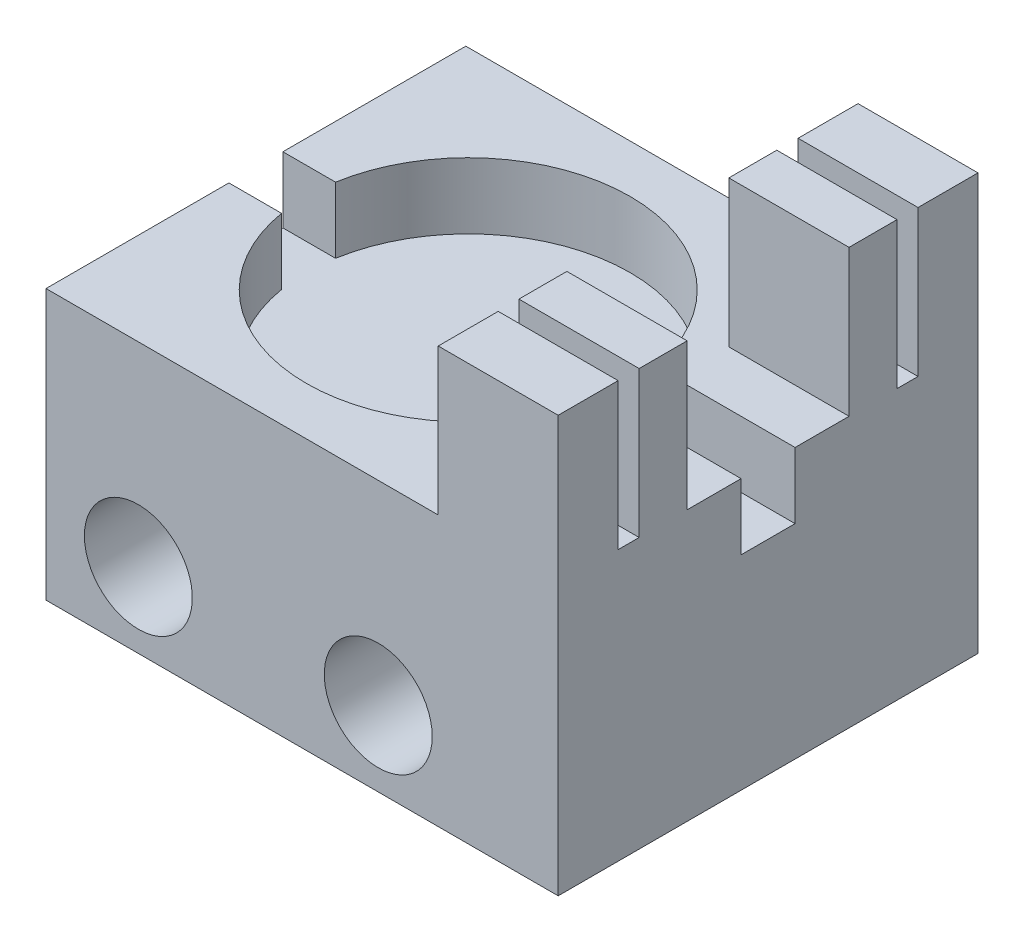
ISO-10303-21;
HEADER;
FILE_DESCRIPTION(('STEP AP214'),'2;1');
FILE_NAME('part.step','',(''),(''),'','','');
FILE_SCHEMA(('AUTOMOTIVE_DESIGN { 1 0 10303 214 1 1 1 1 }'));
ENDSEC;
DATA;
#1=APPLICATION_CONTEXT('core data for automotive mechanical design processes');
#2=APPLICATION_PROTOCOL_DEFINITION('international standard','automotive_design',2000,#1);
#3=PRODUCT_CONTEXT('',#1,'mechanical');
#4=PRODUCT('Part','Part','',(#3));
#5=PRODUCT_RELATED_PRODUCT_CATEGORY('part','',(#4));
#6=PRODUCT_DEFINITION_FORMATION('','',#4);
#7=PRODUCT_DEFINITION_CONTEXT('part definition',#1,'design');
#8=PRODUCT_DEFINITION('design','',#6,#7);
#9=PRODUCT_DEFINITION_SHAPE('','',#8);
#10=(LENGTH_UNIT() NAMED_UNIT(*) SI_UNIT(.MILLI.,.METRE.));
#11=(NAMED_UNIT(*) PLANE_ANGLE_UNIT() SI_UNIT($,.RADIAN.));
#12=(NAMED_UNIT(*) SI_UNIT($,.STERADIAN.) SOLID_ANGLE_UNIT());
#13=UNCERTAINTY_MEASURE_WITH_UNIT(LENGTH_MEASURE(1.E-05),#10,'distance_accuracy_value','');
#14=(GEOMETRIC_REPRESENTATION_CONTEXT(3) GLOBAL_UNCERTAINTY_ASSIGNED_CONTEXT((#13)) GLOBAL_UNIT_ASSIGNED_CONTEXT((#10,
#11,#12)) REPRESENTATION_CONTEXT('',''));
#15=CARTESIAN_POINT('',(0.,0.,0.));
#16=DIRECTION('',(0.,0.,1.));
#17=DIRECTION('',(1.,0.,0.));
#18=AXIS2_PLACEMENT_3D('',#15,#16,#17);
#19=CARTESIAN_POINT('',(-25.,11.25,35.));
#20=DIRECTION('',(0.,-1.,0.));
#21=DIRECTION('',(0.,0.,-1.));
#22=AXIS2_PLACEMENT_3D('',#19,#20,#21);
#23=PLANE('',#22);
#24=DIRECTION('',(1.,0.,0.));
#25=VECTOR('',#24,1.);
#26=CARTESIAN_POINT('',(-13.3111795119741,11.25,19.75));
#27=LINE('',#26,#25);
#28=CARTESIAN_POINT('',(-17.7,11.25,19.75));
#29=VERTEX_POINT('',#28);
#30=CARTESIAN_POINT('',(-13.3111795119741,11.25,19.75));
#31=VERTEX_POINT('',#30);
#32=EDGE_CURVE('E229',#29,#31,#27,.T.);
#33=ORIENTED_EDGE('',*,*,#32,.F.);
#34=DIRECTION('',(0.,0.,-1.));
#35=VECTOR('',#34,1.);
#36=CARTESIAN_POINT('',(-17.7,11.25,35.));
#37=LINE('',#36,#35);
#38=CARTESIAN_POINT('',(-17.7,11.25,35.));
#39=VERTEX_POINT('',#38);
#40=EDGE_CURVE('E215',#39,#29,#37,.T.);
#41=ORIENTED_EDGE('',*,*,#40,.F.);
#42=DIRECTION('',(-1.,0.,0.));
#43=VECTOR('',#42,1.);
#44=CARTESIAN_POINT('',(-25.,11.25,35.));
#45=LINE('',#44,#43);
#46=CARTESIAN_POINT('',(15.,11.25,35.));
#47=VERTEX_POINT('',#46);
#48=EDGE_CURVE('E227',#47,#39,#45,.T.);
#49=ORIENTED_EDGE('',*,*,#48,.F.);
#50=DIRECTION('',(0.,0.,1.));
#51=VECTOR('',#50,1.);
#52=CARTESIAN_POINT('',(15.,11.25,35.));
#53=LINE('',#52,#51);
#54=CARTESIAN_POINT('',(15.,11.25,30.));
#55=VERTEX_POINT('',#54);
#56=EDGE_CURVE('E713',#55,#47,#53,.T.);
#57=ORIENTED_EDGE('',*,*,#56,.F.);
#58=DIRECTION('',(-1.,0.,0.));
#59=VECTOR('',#58,1.);
#60=CARTESIAN_POINT('',(25.,11.25,30.));
#61=LINE('',#60,#59);
#62=CARTESIAN_POINT('',(25.,11.25,30.));
#63=VERTEX_POINT('',#62);
#64=EDGE_CURVE('E704',#63,#55,#61,.T.);
#65=ORIENTED_EDGE('',*,*,#64,.F.);
#66=DIRECTION('',(0.,0.,-1.));
#67=VECTOR('',#66,1.);
#68=CARTESIAN_POINT('',(25.,11.25,35.));
#69=LINE('',#68,#67);
#70=CARTESIAN_POINT('',(25.,11.25,28.25));
#71=VERTEX_POINT('',#70);
#72=EDGE_CURVE('E48',#63,#71,#69,.T.);
#73=ORIENTED_EDGE('',*,*,#72,.T.);
#74=DIRECTION('',(1.,0.,0.));
#75=VECTOR('',#74,1.);
#76=CARTESIAN_POINT('',(25.,11.25,28.25));
#77=LINE('',#76,#75);
#78=CARTESIAN_POINT('',(14.975994484749,11.25,28.25));
#79=VERTEX_POINT('',#78);
#80=EDGE_CURVE('E742',#79,#71,#77,.T.);
#81=ORIENTED_EDGE('',*,*,#80,.F.);
#82=DIRECTION('',(0.,0.,1.));
#83=VECTOR('',#82,1.);
#84=CARTESIAN_POINT('',(14.975994484749,11.25,28.25));
#85=LINE('',#84,#83);
#86=CARTESIAN_POINT('',(14.975994484749,11.25,24.25));
#87=VERTEX_POINT('',#86);
#88=EDGE_CURVE('E755',#87,#79,#85,.T.);
#89=ORIENTED_EDGE('',*,*,#88,.F.);
#90=DIRECTION('',(-1.,0.,0.));
#91=VECTOR('',#90,1.);
#92=CARTESIAN_POINT('',(25.,11.25,24.25));
#93=LINE('',#92,#91);
#94=CARTESIAN_POINT('',(25.,11.25,24.25));
#95=VERTEX_POINT('',#94);
#96=EDGE_CURVE('E736',#95,#87,#93,.T.);
#97=ORIENTED_EDGE('',*,*,#96,.F.);
#98=CARTESIAN_POINT('',(25.,11.25,19.75));
#99=VERTEX_POINT('',#98);
#100=EDGE_CURVE('E259',#95,#99,#69,.T.);
#101=ORIENTED_EDGE('',*,*,#100,.T.);
#102=DIRECTION('',(1.,0.,0.));
#103=VECTOR('',#102,1.);
#104=CARTESIAN_POINT('',(25.,11.25,19.75));
#105=LINE('',#104,#103);
#106=CARTESIAN_POINT('',(13.3111795119741,11.25,19.75));
#107=VERTEX_POINT('',#106);
#108=EDGE_CURVE('E350',#107,#99,#105,.T.);
#109=ORIENTED_EDGE('',*,*,#108,.F.);
#110=CARTESIAN_POINT('',(0.,11.25,17.5));
#111=DIRECTION('',(0.,1.,0.));
#112=DIRECTION('',(0.,0.,1.));
#113=AXIS2_PLACEMENT_3D('',#110,#111,#112);
#114=CIRCLE('',#113,13.5);
#115=EDGE_CURVE('E346',#31,#107,#114,.T.);
#116=ORIENTED_EDGE('',*,*,#115,.F.);
#117=EDGE_LOOP('',(#33,#41,#49,#57,#65,#73,#81,#89,#97,#101,#109,#116));
#118=FACE_BOUND('',#117,.T.);
#119=ADVANCED_FACE('F39',(#118),#23,.F.);
#120=DIRECTION('',(-1.,0.,0.));
#121=VECTOR('',#120,1.);
#122=CARTESIAN_POINT('',(-25.,11.25,0.));
#123=LINE('',#122,#121);
#124=CARTESIAN_POINT('',(15.,11.25,0.));
#125=VERTEX_POINT('',#124);
#126=CARTESIAN_POINT('',(-17.7,11.25,0.));
#127=VERTEX_POINT('',#126);
#128=EDGE_CURVE('E248',#125,#127,#123,.T.);
#129=ORIENTED_EDGE('',*,*,#128,.T.);
#130=CARTESIAN_POINT('',(-17.7,11.25,15.25));
#131=VERTEX_POINT('',#130);
#132=EDGE_CURVE('E220',#131,#127,#37,.T.);
#133=ORIENTED_EDGE('',*,*,#132,.F.);
#134=DIRECTION('',(-1.,0.,0.));
#135=VECTOR('',#134,1.);
#136=CARTESIAN_POINT('',(-13.3111795119741,11.25,15.25));
#137=LINE('',#136,#135);
#138=CARTESIAN_POINT('',(-13.3111795119741,11.25,15.25));
#139=VERTEX_POINT('',#138);
#140=EDGE_CURVE('E311',#139,#131,#137,.T.);
#141=ORIENTED_EDGE('',*,*,#140,.F.);
#142=CARTESIAN_POINT('',(0.,11.25,17.5));
#143=DIRECTION('',(0.,1.,0.));
#144=DIRECTION('',(0.,0.,1.));
#145=AXIS2_PLACEMENT_3D('',#142,#143,#144);
#146=CIRCLE('',#145,13.5);
#147=CARTESIAN_POINT('',(13.3111795119741,11.25,15.25));
#148=VERTEX_POINT('',#147);
#149=EDGE_CURVE('E317',#148,#139,#146,.T.);
#150=ORIENTED_EDGE('',*,*,#149,.F.);
#151=DIRECTION('',(-1.,0.,0.));
#152=VECTOR('',#151,1.);
#153=CARTESIAN_POINT('',(25.,11.25,15.25));
#154=LINE('',#153,#152);
#155=CARTESIAN_POINT('',(25.,11.25,15.25));
#156=VERTEX_POINT('',#155);
#157=EDGE_CURVE('E354',#156,#148,#154,.T.);
#158=ORIENTED_EDGE('',*,*,#157,.F.);
#159=CARTESIAN_POINT('',(25.,11.25,10.75));
#160=VERTEX_POINT('',#159);
#161=EDGE_CURVE('E260',#156,#160,#69,.T.);
#162=ORIENTED_EDGE('',*,*,#161,.T.);
#163=DIRECTION('',(1.,0.,0.));
#164=VECTOR('',#163,1.);
#165=CARTESIAN_POINT('',(25.,11.25,10.75));
#166=LINE('',#165,#164);
#167=CARTESIAN_POINT('',(14.975994484749,11.25,10.75));
#168=VERTEX_POINT('',#167);
#169=EDGE_CURVE('E780',#168,#160,#166,.T.);
#170=ORIENTED_EDGE('',*,*,#169,.F.);
#171=DIRECTION('',(0.,0.,1.));
#172=VECTOR('',#171,1.);
#173=CARTESIAN_POINT('',(14.975994484749,11.25,6.75));
#174=LINE('',#173,#172);
#175=CARTESIAN_POINT('',(14.975994484749,11.25,6.75));
#176=VERTEX_POINT('',#175);
#177=EDGE_CURVE('E792',#176,#168,#174,.T.);
#178=ORIENTED_EDGE('',*,*,#177,.F.);
#179=DIRECTION('',(-1.,0.,0.));
#180=VECTOR('',#179,1.);
#181=CARTESIAN_POINT('',(25.,11.25,6.75));
#182=LINE('',#181,#180);
#183=CARTESIAN_POINT('',(25.,11.25,6.75));
#184=VERTEX_POINT('',#183);
#185=EDGE_CURVE('E278',#184,#176,#182,.T.);
#186=ORIENTED_EDGE('',*,*,#185,.F.);
#187=CARTESIAN_POINT('',(25.,11.25,5.));
#188=VERTEX_POINT('',#187);
#189=EDGE_CURVE('E257',#184,#188,#69,.T.);
#190=ORIENTED_EDGE('',*,*,#189,.T.);
#191=DIRECTION('',(1.,0.,0.));
#192=VECTOR('',#191,1.);
#193=CARTESIAN_POINT('',(25.,11.25,5.));
#194=LINE('',#193,#192);
#195=CARTESIAN_POINT('',(15.,11.25,5.));
#196=VERTEX_POINT('',#195);
#197=EDGE_CURVE('E275',#196,#188,#194,.T.);
#198=ORIENTED_EDGE('',*,*,#197,.F.);
#199=DIRECTION('',(0.,0.,1.));
#200=VECTOR('',#199,1.);
#201=CARTESIAN_POINT('',(15.,11.25,0.));
#202=LINE('',#201,#200);
#203=EDGE_CURVE('E294',#125,#196,#202,.T.);
#204=ORIENTED_EDGE('',*,*,#203,.F.);
#205=EDGE_LOOP('',(#129,#133,#141,#150,#158,#162,#170,#178,#186,#190,#198,#204));
#206=FACE_BOUND('',#205,.T.);
#207=ADVANCED_FACE('F273',(#206),#23,.F.);
#208=CARTESIAN_POINT('',(25.,-11.25,35.));
#209=DIRECTION('',(-1.,0.,0.));
#210=DIRECTION('',(0.,0.,1.));
#211=AXIS2_PLACEMENT_3D('',#208,#209,#210);
#212=PLANE('',#211);
#213=ORIENTED_EDGE('',*,*,#161,.F.);
#214=DIRECTION('',(0.,1.,0.));
#215=VECTOR('',#214,1.);
#216=CARTESIAN_POINT('',(25.,5.75,15.25));
#217=LINE('',#216,#215);
#218=CARTESIAN_POINT('',(25.,5.75,15.25));
#219=VERTEX_POINT('',#218);
#220=EDGE_CURVE('E368',#219,#156,#217,.T.);
#221=ORIENTED_EDGE('',*,*,#220,.F.);
#222=DIRECTION('',(0.,0.,-1.));
#223=VECTOR('',#222,1.);
#224=CARTESIAN_POINT('',(25.,5.75,19.75));
#225=LINE('',#224,#223);
#226=CARTESIAN_POINT('',(25.,5.75,19.75));
#227=VERTEX_POINT('',#226);
#228=EDGE_CURVE('E328',#227,#219,#225,.T.);
#229=ORIENTED_EDGE('',*,*,#228,.F.);
#230=DIRECTION('',(0.,1.,0.));
#231=VECTOR('',#230,1.);
#232=CARTESIAN_POINT('',(25.,5.75,19.75));
#233=LINE('',#232,#231);
#234=EDGE_CURVE('E371',#227,#99,#233,.T.);
#235=ORIENTED_EDGE('',*,*,#234,.T.);
#236=ORIENTED_EDGE('',*,*,#100,.F.);
#237=DIRECTION('',(0.,-1.,0.));
#238=VECTOR('',#237,1.);
#239=CARTESIAN_POINT('',(25.,23.45,24.25));
#240=LINE('',#239,#238);
#241=CARTESIAN_POINT('',(25.,23.45,24.25));
#242=VERTEX_POINT('',#241);
#243=EDGE_CURVE('E772',#242,#95,#240,.T.);
#244=ORIENTED_EDGE('',*,*,#243,.F.);
#245=DIRECTION('',(0.,0.,-1.));
#246=VECTOR('',#245,1.);
#247=CARTESIAN_POINT('',(25.,23.45,28.25));
#248=LINE('',#247,#246);
#249=CARTESIAN_POINT('',(25.,23.45,28.25));
#250=VERTEX_POINT('',#249);
#251=EDGE_CURVE('E737',#250,#242,#248,.T.);
#252=ORIENTED_EDGE('',*,*,#251,.F.);
#253=DIRECTION('',(0.,-1.,0.));
#254=VECTOR('',#253,1.);
#255=CARTESIAN_POINT('',(25.,23.45,28.25));
#256=LINE('',#255,#254);
#257=EDGE_CURVE('E751',#250,#71,#256,.T.);
#258=ORIENTED_EDGE('',*,*,#257,.T.);
#259=ORIENTED_EDGE('',*,*,#72,.F.);
#260=DIRECTION('',(0.,-1.,0.));
#261=VECTOR('',#260,1.);
#262=CARTESIAN_POINT('',(25.,23.45,30.));
#263=LINE('',#262,#261);
#264=CARTESIAN_POINT('',(25.,23.45,30.));
#265=VERTEX_POINT('',#264);
#266=EDGE_CURVE('E733',#265,#63,#263,.T.);
#267=ORIENTED_EDGE('',*,*,#266,.F.);
#268=DIRECTION('',(0.,0.,-1.));
#269=VECTOR('',#268,1.);
#270=CARTESIAN_POINT('',(25.,23.45,35.));
#271=LINE('',#270,#269);
#272=CARTESIAN_POINT('',(25.,23.45,35.));
#273=VERTEX_POINT('',#272);
#274=EDGE_CURVE('E708',#273,#265,#271,.T.);
#275=ORIENTED_EDGE('',*,*,#274,.F.);
#276=DIRECTION('',(0.,1.,0.));
#277=VECTOR('',#276,1.);
#278=CARTESIAN_POINT('',(25.,-11.25,35.));
#279=LINE('',#278,#277);
#280=CARTESIAN_POINT('',(25.,-11.25,35.));
#281=VERTEX_POINT('',#280);
#282=EDGE_CURVE('E235',#281,#273,#279,.T.);
#283=ORIENTED_EDGE('',*,*,#282,.F.);
#284=DIRECTION('',(0.,0.,-1.));
#285=VECTOR('',#284,1.);
#286=CARTESIAN_POINT('',(25.,-11.25,35.));
#287=LINE('',#286,#285);
#288=CARTESIAN_POINT('',(25.,-11.25,0.));
#289=VERTEX_POINT('',#288);
#290=EDGE_CURVE('E239',#281,#289,#287,.T.);
#291=ORIENTED_EDGE('',*,*,#290,.T.);
#292=DIRECTION('',(0.,1.,0.));
#293=VECTOR('',#292,1.);
#294=CARTESIAN_POINT('',(25.,-11.25,0.));
#295=LINE('',#294,#293);
#296=CARTESIAN_POINT('',(25.,23.45,0.));
#297=VERTEX_POINT('',#296);
#298=EDGE_CURVE('E245',#289,#297,#295,.T.);
#299=ORIENTED_EDGE('',*,*,#298,.T.);
#300=DIRECTION('',(0.,0.,-1.));
#301=VECTOR('',#300,1.);
#302=CARTESIAN_POINT('',(25.,23.45,0.));
#303=LINE('',#302,#301);
#304=CARTESIAN_POINT('',(25.,23.45,5.));
#305=VERTEX_POINT('',#304);
#306=EDGE_CURVE('E293',#305,#297,#303,.T.);
#307=ORIENTED_EDGE('',*,*,#306,.F.);
#308=DIRECTION('',(0.,-1.,0.));
#309=VECTOR('',#308,1.);
#310=CARTESIAN_POINT('',(25.,23.45,5.));
#311=LINE('',#310,#309);
#312=EDGE_CURVE('E288',#305,#188,#311,.T.);
#313=ORIENTED_EDGE('',*,*,#312,.T.);
#314=ORIENTED_EDGE('',*,*,#189,.F.);
#315=DIRECTION('',(0.,-1.,0.));
#316=VECTOR('',#315,1.);
#317=CARTESIAN_POINT('',(25.,23.45,6.75));
#318=LINE('',#317,#316);
#319=CARTESIAN_POINT('',(25.,23.45,6.75));
#320=VERTEX_POINT('',#319);
#321=EDGE_CURVE('E809',#320,#184,#318,.T.);
#322=ORIENTED_EDGE('',*,*,#321,.F.);
#323=DIRECTION('',(0.,0.,-1.));
#324=VECTOR('',#323,1.);
#325=CARTESIAN_POINT('',(25.,23.45,6.75));
#326=LINE('',#325,#324);
#327=CARTESIAN_POINT('',(25.,23.45,10.75));
#328=VERTEX_POINT('',#327);
#329=EDGE_CURVE('E775',#328,#320,#326,.T.);
#330=ORIENTED_EDGE('',*,*,#329,.F.);
#331=DIRECTION('',(0.,-1.,0.));
#332=VECTOR('',#331,1.);
#333=CARTESIAN_POINT('',(25.,23.45,10.75));
#334=LINE('',#333,#332);
#335=EDGE_CURVE('E789',#328,#160,#334,.T.);
#336=ORIENTED_EDGE('',*,*,#335,.T.);
#337=EDGE_LOOP('',(#213,#221,#229,#235,#236,#244,#252,#258,#259,#267,#275,#283,#291,#299,#307,
#313,#314,#322,#330,#336));
#338=FACE_BOUND('',#337,.T.);
#339=ADVANCED_FACE('F41',(#338),#212,.F.);
#340=CARTESIAN_POINT('',(-25.,-11.25,35.));
#341=DIRECTION('',(0.,1.,0.));
#342=DIRECTION('',(0.,0.,1.));
#343=AXIS2_PLACEMENT_3D('',#340,#341,#342);
#344=PLANE('',#343);
#345=DIRECTION('',(1.,0.,0.));
#346=VECTOR('',#345,1.);
#347=CARTESIAN_POINT('',(-25.,-11.25,35.));
#348=LINE('',#347,#346);
#349=CARTESIAN_POINT('',(-17.7,-11.25,35.));
#350=VERTEX_POINT('',#349);
#351=EDGE_CURVE('E234',#350,#281,#348,.T.);
#352=ORIENTED_EDGE('',*,*,#351,.F.);
#353=DIRECTION('',(0.,0.,-1.));
#354=VECTOR('',#353,1.);
#355=CARTESIAN_POINT('',(-17.7,-11.25,35.));
#356=LINE('',#355,#354);
#357=CARTESIAN_POINT('',(-17.7,-11.25,0.));
#358=VERTEX_POINT('',#357);
#359=EDGE_CURVE('E217',#350,#358,#356,.T.);
#360=ORIENTED_EDGE('',*,*,#359,.T.);
#361=DIRECTION('',(1.,0.,0.));
#362=VECTOR('',#361,1.);
#363=CARTESIAN_POINT('',(-25.,-11.25,0.));
#364=LINE('',#363,#362);
#365=EDGE_CURVE('E241',#358,#289,#364,.T.);
#366=ORIENTED_EDGE('',*,*,#365,.T.);
#367=ORIENTED_EDGE('',*,*,#290,.F.);
#368=EDGE_LOOP('',(#352,#360,#366,#367));
#369=FACE_BOUND('',#368,.T.);
#370=ADVANCED_FACE('F399',(#369),#344,.F.);
#371=CARTESIAN_POINT('',(0.,0.,35.));
#372=DIRECTION('',(0.,0.,-1.));
#373=DIRECTION('',(-1.,0.,0.));
#374=AXIS2_PLACEMENT_3D('',#371,#372,#373);
#375=PLANE('',#374);
#376=CARTESIAN_POINT('',(10.,-5.,35.));
#377=DIRECTION('',(0.,0.,1.));
#378=DIRECTION('',(1.,0.,0.));
#379=AXIS2_PLACEMENT_3D('',#376,#377,#378);
#380=CIRCLE('',#379,4.5);
#381=CARTESIAN_POINT('',(14.5,-5.,35.));
#382=VERTEX_POINT('',#381);
#383=EDGE_CURVE('E384',#382,#382,#380,.T.);
#384=ORIENTED_EDGE('',*,*,#383,.F.);
#385=EDGE_LOOP('',(#384));
#386=FACE_BOUND('',#385,.T.);
#387=CARTESIAN_POINT('',(-10.,-4.99999999999998,35.));
#388=DIRECTION('',(0.,0.,1.));
#389=DIRECTION('',(-1.,0.,0.));
#390=AXIS2_PLACEMENT_3D('',#387,#388,#389);
#391=CIRCLE('',#390,4.5);
#392=CARTESIAN_POINT('',(-14.5,-4.99999999999998,35.));
#393=VERTEX_POINT('',#392);
#394=EDGE_CURVE('E364',#393,#393,#391,.T.);
#395=ORIENTED_EDGE('',*,*,#394,.F.);
#396=EDGE_LOOP('',(#395));
#397=FACE_BOUND('',#396,.T.);
#398=ORIENTED_EDGE('',*,*,#48,.T.);
#399=DIRECTION('',(0.,-1.,0.));
#400=VECTOR('',#399,1.);
#401=CARTESIAN_POINT('',(-17.7,11.25,35.));
#402=LINE('',#401,#400);
#403=EDGE_CURVE('E212',#39,#350,#402,.T.);
#404=ORIENTED_EDGE('',*,*,#403,.T.);
#405=ORIENTED_EDGE('',*,*,#351,.T.);
#406=ORIENTED_EDGE('',*,*,#282,.T.);
#407=DIRECTION('',(1.,0.,0.));
#408=VECTOR('',#407,1.);
#409=CARTESIAN_POINT('',(25.,23.45,35.));
#410=LINE('',#409,#408);
#411=CARTESIAN_POINT('',(15.,23.45,35.));
#412=VERTEX_POINT('',#411);
#413=EDGE_CURVE('E719',#412,#273,#410,.T.);
#414=ORIENTED_EDGE('',*,*,#413,.F.);
#415=DIRECTION('',(0.,-1.,0.));
#416=VECTOR('',#415,1.);
#417=CARTESIAN_POINT('',(15.,23.45,35.));
#418=LINE('',#417,#416);
#419=EDGE_CURVE('E62',#412,#47,#418,.T.);
#420=ORIENTED_EDGE('',*,*,#419,.T.);
#421=EDGE_LOOP('',(#398,#404,#405,#406,#414,#420));
#422=FACE_BOUND('',#421,.T.);
#423=ADVANCED_FACE('F232',(#386,#397,#422),#375,.F.);
#424=CARTESIAN_POINT('',(0.,0.,0.));
#425=DIRECTION('',(0.,0.,-1.));
#426=DIRECTION('',(-1.,0.,0.));
#427=AXIS2_PLACEMENT_3D('',#424,#425,#426);
#428=PLANE('',#427);
#429=DIRECTION('',(0.,-1.,0.));
#430=VECTOR('',#429,1.);
#431=CARTESIAN_POINT('',(-17.7,11.25,0.));
#432=LINE('',#431,#430);
#433=EDGE_CURVE('E221',#127,#358,#432,.T.);
#434=ORIENTED_EDGE('',*,*,#433,.F.);
#435=ORIENTED_EDGE('',*,*,#128,.F.);
#436=DIRECTION('',(0.,-1.,0.));
#437=VECTOR('',#436,1.);
#438=CARTESIAN_POINT('',(15.,23.45,0.));
#439=LINE('',#438,#437);
#440=CARTESIAN_POINT('',(15.,23.45,0.));
#441=VERTEX_POINT('',#440);
#442=EDGE_CURVE('E302',#441,#125,#439,.T.);
#443=ORIENTED_EDGE('',*,*,#442,.F.);
#444=DIRECTION('',(-1.,0.,0.));
#445=VECTOR('',#444,1.);
#446=CARTESIAN_POINT('',(25.,23.45,0.));
#447=LINE('',#446,#445);
#448=EDGE_CURVE('E814',#297,#441,#447,.T.);
#449=ORIENTED_EDGE('',*,*,#448,.F.);
#450=ORIENTED_EDGE('',*,*,#298,.F.);
#451=ORIENTED_EDGE('',*,*,#365,.F.);
#452=EDGE_LOOP('',(#434,#435,#443,#449,#450,#451));
#453=FACE_BOUND('',#452,.T.);
#454=CARTESIAN_POINT('',(10.,-5.,0.));
#455=DIRECTION('',(0.,0.,1.));
#456=DIRECTION('',(1.,0.,0.));
#457=AXIS2_PLACEMENT_3D('',#454,#455,#456);
#458=CIRCLE('',#457,4.5);
#459=CARTESIAN_POINT('',(14.5,-5.,0.));
#460=VERTEX_POINT('',#459);
#461=EDGE_CURVE('E249',#460,#460,#458,.T.);
#462=ORIENTED_EDGE('',*,*,#461,.T.);
#463=EDGE_LOOP('',(#462));
#464=FACE_BOUND('',#463,.T.);
#465=CARTESIAN_POINT('',(-10.,-4.99999999999998,0.));
#466=DIRECTION('',(0.,0.,1.));
#467=DIRECTION('',(-1.,0.,0.));
#468=AXIS2_PLACEMENT_3D('',#465,#466,#467);
#469=CIRCLE('',#468,4.5);
#470=CARTESIAN_POINT('',(-14.5,-4.99999999999998,0.));
#471=VERTEX_POINT('',#470);
#472=EDGE_CURVE('E388',#471,#471,#469,.T.);
#473=ORIENTED_EDGE('',*,*,#472,.T.);
#474=EDGE_LOOP('',(#473));
#475=FACE_BOUND('',#474,.T.);
#476=ADVANCED_FACE('F398',(#453,#464,#475),#428,.T.);
#477=CARTESIAN_POINT('',(-10.,-4.99999999999998,0.));
#478=DIRECTION('',(0.,0.,1.));
#479=DIRECTION('',(1.,0.,0.));
#480=AXIS2_PLACEMENT_3D('',#477,#478,#479);
#481=CYLINDRICAL_SURFACE('',#480,4.5);
#482=ORIENTED_EDGE('',*,*,#472,.F.);
#483=EDGE_LOOP('',(#482));
#484=FACE_BOUND('',#483,.T.);
#485=ORIENTED_EDGE('',*,*,#394,.T.);
#486=EDGE_LOOP('',(#485));
#487=FACE_BOUND('',#486,.T.);
#488=ADVANCED_FACE('F395',(#484,#487),#481,.F.);
#489=CARTESIAN_POINT('',(10.,-5.,0.));
#490=DIRECTION('',(0.,0.,1.));
#491=DIRECTION('',(1.,0.,0.));
#492=AXIS2_PLACEMENT_3D('',#489,#490,#491);
#493=CYLINDRICAL_SURFACE('',#492,4.5);
#494=ORIENTED_EDGE('',*,*,#461,.F.);
#495=EDGE_LOOP('',(#494));
#496=FACE_BOUND('',#495,.T.);
#497=ORIENTED_EDGE('',*,*,#383,.T.);
#498=EDGE_LOOP('',(#497));
#499=FACE_BOUND('',#498,.T.);
#500=ADVANCED_FACE('F455',(#496,#499),#493,.F.);
#501=CARTESIAN_POINT('',(-13.3111795119741,5.75,15.25));
#502=DIRECTION('',(0.,0.,-1.));
#503=DIRECTION('',(-1.,0.,0.));
#504=AXIS2_PLACEMENT_3D('',#501,#502,#503);
#505=PLANE('',#504);
#506=ORIENTED_EDGE('',*,*,#140,.T.);
#507=DIRECTION('',(0.,-1.,0.));
#508=VECTOR('',#507,1.);
#509=CARTESIAN_POINT('',(-17.7,5.75,15.25));
#510=LINE('',#509,#508);
#511=CARTESIAN_POINT('',(-17.7,5.75,15.25));
#512=VERTEX_POINT('',#511);
#513=EDGE_CURVE('E699',#131,#512,#510,.T.);
#514=ORIENTED_EDGE('',*,*,#513,.T.);
#515=DIRECTION('',(-1.,0.,0.));
#516=VECTOR('',#515,1.);
#517=CARTESIAN_POINT('',(-13.3111795119741,5.75,15.25));
#518=LINE('',#517,#516);
#519=CARTESIAN_POINT('',(-13.3111795119741,5.75,15.25));
#520=VERTEX_POINT('',#519);
#521=EDGE_CURVE('E312',#520,#512,#518,.T.);
#522=ORIENTED_EDGE('',*,*,#521,.F.);
#523=DIRECTION('',(0.,1.,0.));
#524=VECTOR('',#523,1.);
#525=CARTESIAN_POINT('',(-13.3111795119741,5.75,15.25));
#526=LINE('',#525,#524);
#527=EDGE_CURVE('E361',#520,#139,#526,.T.);
#528=ORIENTED_EDGE('',*,*,#527,.T.);
#529=EDGE_LOOP('',(#506,#514,#522,#528));
#530=FACE_BOUND('',#529,.T.);
#531=ADVANCED_FACE('F449',(#530),#505,.F.);
#532=CARTESIAN_POINT('',(0.,5.75,17.5));
#533=DIRECTION('',(0.,1.,0.));
#534=DIRECTION('',(0.,0.,1.));
#535=AXIS2_PLACEMENT_3D('',#532,#533,#534);
#536=CYLINDRICAL_SURFACE('',#535,13.5);
#537=ORIENTED_EDGE('',*,*,#149,.T.);
#538=ORIENTED_EDGE('',*,*,#527,.F.);
#539=CARTESIAN_POINT('',(0.,5.75,17.5));
#540=DIRECTION('',(0.,1.,0.));
#541=DIRECTION('',(0.,0.,1.));
#542=AXIS2_PLACEMENT_3D('',#539,#540,#541);
#543=CIRCLE('',#542,13.5);
#544=CARTESIAN_POINT('',(13.3111795119741,5.75,15.25));
#545=VERTEX_POINT('',#544);
#546=EDGE_CURVE('E336',#545,#520,#543,.T.);
#547=ORIENTED_EDGE('',*,*,#546,.F.);
#548=DIRECTION('',(0.,1.,0.));
#549=VECTOR('',#548,1.);
#550=CARTESIAN_POINT('',(13.3111795119741,5.75,15.25));
#551=LINE('',#550,#549);
#552=EDGE_CURVE('E365',#545,#148,#551,.T.);
#553=ORIENTED_EDGE('',*,*,#552,.T.);
#554=EDGE_LOOP('',(#537,#538,#547,#553));
#555=FACE_BOUND('',#554,.T.);
#556=ADVANCED_FACE('F454',(#555),#536,.F.);
#557=CARTESIAN_POINT('',(25.,5.75,15.25));
#558=DIRECTION('',(0.,0.,-1.));
#559=DIRECTION('',(-1.,0.,0.));
#560=AXIS2_PLACEMENT_3D('',#557,#558,#559);
#561=PLANE('',#560);
#562=ORIENTED_EDGE('',*,*,#157,.T.);
#563=ORIENTED_EDGE('',*,*,#552,.F.);
#564=DIRECTION('',(-1.,0.,0.));
#565=VECTOR('',#564,1.);
#566=CARTESIAN_POINT('',(25.,5.75,15.25));
#567=LINE('',#566,#565);
#568=EDGE_CURVE('E332',#219,#545,#567,.T.);
#569=ORIENTED_EDGE('',*,*,#568,.F.);
#570=ORIENTED_EDGE('',*,*,#220,.T.);
#571=EDGE_LOOP('',(#562,#563,#569,#570));
#572=FACE_BOUND('',#571,.T.);
#573=ADVANCED_FACE('F633',(#572),#561,.F.);
#574=CARTESIAN_POINT('',(25.,5.75,19.75));
#575=DIRECTION('',(0.,0.,1.));
#576=DIRECTION('',(1.,0.,0.));
#577=AXIS2_PLACEMENT_3D('',#574,#575,#576);
#578=PLANE('',#577);
#579=ORIENTED_EDGE('',*,*,#108,.T.);
#580=ORIENTED_EDGE('',*,*,#234,.F.);
#581=DIRECTION('',(1.,0.,0.));
#582=VECTOR('',#581,1.);
#583=CARTESIAN_POINT('',(25.,5.75,19.75));
#584=LINE('',#583,#582);
#585=CARTESIAN_POINT('',(13.3111795119741,5.75,19.75));
#586=VERTEX_POINT('',#585);
#587=EDGE_CURVE('E324',#586,#227,#584,.T.);
#588=ORIENTED_EDGE('',*,*,#587,.F.);
#589=DIRECTION('',(0.,1.,0.));
#590=VECTOR('',#589,1.);
#591=CARTESIAN_POINT('',(13.3111795119741,5.75,19.75));
#592=LINE('',#591,#590);
#593=EDGE_CURVE('E375',#586,#107,#592,.T.);
#594=ORIENTED_EDGE('',*,*,#593,.T.);
#595=EDGE_LOOP('',(#579,#580,#588,#594));
#596=FACE_BOUND('',#595,.T.);
#597=ADVANCED_FACE('F637',(#596),#578,.F.);
#598=CARTESIAN_POINT('',(0.,5.75,17.5));
#599=DIRECTION('',(0.,1.,0.));
#600=DIRECTION('',(0.,0.,1.));
#601=AXIS2_PLACEMENT_3D('',#598,#599,#600);
#602=CYLINDRICAL_SURFACE('',#601,13.5);
#603=ORIENTED_EDGE('',*,*,#115,.T.);
#604=ORIENTED_EDGE('',*,*,#593,.F.);
#605=CARTESIAN_POINT('',(0.,5.75,17.5));
#606=DIRECTION('',(0.,1.,0.));
#607=DIRECTION('',(0.,0.,1.));
#608=AXIS2_PLACEMENT_3D('',#605,#606,#607);
#609=CIRCLE('',#608,13.5);
#610=CARTESIAN_POINT('',(-13.3111795119741,5.75,19.75));
#611=VERTEX_POINT('',#610);
#612=EDGE_CURVE('E320',#611,#586,#609,.T.);
#613=ORIENTED_EDGE('',*,*,#612,.F.);
#614=DIRECTION('',(0.,1.,0.));
#615=VECTOR('',#614,1.);
#616=CARTESIAN_POINT('',(-13.3111795119741,5.75,19.75));
#617=LINE('',#616,#615);
#618=EDGE_CURVE('E340',#611,#31,#617,.T.);
#619=ORIENTED_EDGE('',*,*,#618,.T.);
#620=EDGE_LOOP('',(#603,#604,#613,#619));
#621=FACE_BOUND('',#620,.T.);
#622=ADVANCED_FACE('F471',(#621),#602,.F.);
#623=CARTESIAN_POINT('',(-13.3111795119741,5.75,19.75));
#624=DIRECTION('',(0.,0.,1.));
#625=DIRECTION('',(1.,0.,0.));
#626=AXIS2_PLACEMENT_3D('',#623,#624,#625);
#627=PLANE('',#626);
#628=DIRECTION('',(1.,0.,0.));
#629=VECTOR('',#628,1.);
#630=CARTESIAN_POINT('',(-13.3111795119741,5.75,19.75));
#631=LINE('',#630,#629);
#632=CARTESIAN_POINT('',(-17.7,5.75,19.75));
#633=VERTEX_POINT('',#632);
#634=EDGE_CURVE('E316',#633,#611,#631,.T.);
#635=ORIENTED_EDGE('',*,*,#634,.F.);
#636=DIRECTION('',(0.,1.,0.));
#637=VECTOR('',#636,1.);
#638=CARTESIAN_POINT('',(-17.7,5.75,19.75));
#639=LINE('',#638,#637);
#640=EDGE_CURVE('E54',#633,#29,#639,.T.);
#641=ORIENTED_EDGE('',*,*,#640,.T.);
#642=ORIENTED_EDGE('',*,*,#32,.T.);
#643=ORIENTED_EDGE('',*,*,#618,.F.);
#644=EDGE_LOOP('',(#635,#641,#642,#643));
#645=FACE_BOUND('',#644,.T.);
#646=ADVANCED_FACE('F465',(#645),#627,.F.);
#647=CARTESIAN_POINT('',(0.,5.75,17.5));
#648=DIRECTION('',(0.,1.,0.));
#649=DIRECTION('',(0.,0.,1.));
#650=AXIS2_PLACEMENT_3D('',#647,#648,#649);
#651=PLANE('',#650);
#652=DIRECTION('',(0.,0.,-1.));
#653=VECTOR('',#652,1.);
#654=CARTESIAN_POINT('',(-17.7,5.75,17.5));
#655=LINE('',#654,#653);
#656=EDGE_CURVE('E11',#633,#512,#655,.T.);
#657=ORIENTED_EDGE('',*,*,#656,.F.);
#658=ORIENTED_EDGE('',*,*,#634,.T.);
#659=ORIENTED_EDGE('',*,*,#612,.T.);
#660=ORIENTED_EDGE('',*,*,#587,.T.);
#661=ORIENTED_EDGE('',*,*,#228,.T.);
#662=ORIENTED_EDGE('',*,*,#568,.T.);
#663=ORIENTED_EDGE('',*,*,#546,.T.);
#664=ORIENTED_EDGE('',*,*,#521,.T.);
#665=EDGE_LOOP('',(#657,#658,#659,#660,#661,#662,#663,#664));
#666=FACE_BOUND('',#665,.T.);
#667=ADVANCED_FACE('F470',(#666),#651,.T.);
#668=CARTESIAN_POINT('',(15.,23.45,0.));
#669=DIRECTION('',(1.,0.,0.));
#670=DIRECTION('',(0.,0.,-1.));
#671=AXIS2_PLACEMENT_3D('',#668,#669,#670);
#672=PLANE('',#671);
#673=ORIENTED_EDGE('',*,*,#203,.T.);
#674=DIRECTION('',(0.,-1.,0.));
#675=VECTOR('',#674,1.);
#676=CARTESIAN_POINT('',(15.,23.45,5.));
#677=LINE('',#676,#675);
#678=CARTESIAN_POINT('',(15.,23.45,5.));
#679=VERTEX_POINT('',#678);
#680=EDGE_CURVE('E291',#679,#196,#677,.T.);
#681=ORIENTED_EDGE('',*,*,#680,.F.);
#682=DIRECTION('',(0.,0.,1.));
#683=VECTOR('',#682,1.);
#684=CARTESIAN_POINT('',(15.,23.45,0.));
#685=LINE('',#684,#683);
#686=EDGE_CURVE('E304',#441,#679,#685,.T.);
#687=ORIENTED_EDGE('',*,*,#686,.F.);
#688=ORIENTED_EDGE('',*,*,#442,.T.);
#689=EDGE_LOOP('',(#673,#681,#687,#688));
#690=FACE_BOUND('',#689,.T.);
#691=ADVANCED_FACE('F483',(#690),#672,.F.);
#692=CARTESIAN_POINT('',(25.,23.45,5.));
#693=DIRECTION('',(0.,0.,-1.));
#694=DIRECTION('',(-1.,0.,0.));
#695=AXIS2_PLACEMENT_3D('',#692,#693,#694);
#696=PLANE('',#695);
#697=ORIENTED_EDGE('',*,*,#197,.T.);
#698=ORIENTED_EDGE('',*,*,#312,.F.);
#699=DIRECTION('',(1.,0.,0.));
#700=VECTOR('',#699,1.);
#701=CARTESIAN_POINT('',(25.,23.45,5.));
#702=LINE('',#701,#700);
#703=EDGE_CURVE('E298',#679,#305,#702,.T.);
#704=ORIENTED_EDGE('',*,*,#703,.F.);
#705=ORIENTED_EDGE('',*,*,#680,.T.);
#706=EDGE_LOOP('',(#697,#698,#704,#705));
#707=FACE_BOUND('',#706,.T.);
#708=ADVANCED_FACE('F286',(#707),#696,.F.);
#709=CARTESIAN_POINT('',(0.,23.45,0.));
#710=DIRECTION('',(0.,-1.,0.));
#711=DIRECTION('',(0.,0.,-1.));
#712=AXIS2_PLACEMENT_3D('',#709,#710,#711);
#713=PLANE('',#712);
#714=ORIENTED_EDGE('',*,*,#306,.T.);
#715=ORIENTED_EDGE('',*,*,#448,.T.);
#716=ORIENTED_EDGE('',*,*,#686,.T.);
#717=ORIENTED_EDGE('',*,*,#703,.T.);
#718=EDGE_LOOP('',(#714,#715,#716,#717));
#719=FACE_BOUND('',#718,.T.);
#720=ADVANCED_FACE('F582',(#719),#713,.F.);
#721=CARTESIAN_POINT('',(25.,23.45,6.75));
#722=DIRECTION('',(0.,0.,1.));
#723=DIRECTION('',(1.,0.,0.));
#724=AXIS2_PLACEMENT_3D('',#721,#722,#723);
#725=PLANE('',#724);
#726=ORIENTED_EDGE('',*,*,#185,.T.);
#727=DIRECTION('',(0.,-1.,0.));
#728=VECTOR('',#727,1.);
#729=CARTESIAN_POINT('',(14.975994484749,23.45,6.75));
#730=LINE('',#729,#728);
#731=CARTESIAN_POINT('',(14.975994484749,23.45,6.75));
#732=VERTEX_POINT('',#731);
#733=EDGE_CURVE('E805',#732,#176,#730,.T.);
#734=ORIENTED_EDGE('',*,*,#733,.F.);
#735=DIRECTION('',(-1.,0.,0.));
#736=VECTOR('',#735,1.);
#737=CARTESIAN_POINT('',(25.,23.45,6.75));
#738=LINE('',#737,#736);
#739=EDGE_CURVE('E779',#320,#732,#738,.T.);
#740=ORIENTED_EDGE('',*,*,#739,.F.);
#741=ORIENTED_EDGE('',*,*,#321,.T.);
#742=EDGE_LOOP('',(#726,#734,#740,#741));
#743=FACE_BOUND('',#742,.T.);
#744=ADVANCED_FACE('F574',(#743),#725,.F.);
#745=CARTESIAN_POINT('',(14.975994484749,23.45,6.75));
#746=DIRECTION('',(1.,0.,0.));
#747=DIRECTION('',(0.,0.,-1.));
#748=AXIS2_PLACEMENT_3D('',#745,#746,#747);
#749=PLANE('',#748);
#750=ORIENTED_EDGE('',*,*,#177,.T.);
#751=DIRECTION('',(0.,-1.,0.));
#752=VECTOR('',#751,1.);
#753=CARTESIAN_POINT('',(14.975994484749,23.45,10.75));
#754=LINE('',#753,#752);
#755=CARTESIAN_POINT('',(14.975994484749,23.45,10.75));
#756=VERTEX_POINT('',#755);
#757=EDGE_CURVE('E801',#756,#168,#754,.T.);
#758=ORIENTED_EDGE('',*,*,#757,.F.);
#759=DIRECTION('',(0.,0.,1.));
#760=VECTOR('',#759,1.);
#761=CARTESIAN_POINT('',(14.975994484749,23.45,6.75));
#762=LINE('',#761,#760);
#763=EDGE_CURVE('E783',#732,#756,#762,.T.);
#764=ORIENTED_EDGE('',*,*,#763,.F.);
#765=ORIENTED_EDGE('',*,*,#733,.T.);
#766=EDGE_LOOP('',(#750,#758,#764,#765));
#767=FACE_BOUND('',#766,.T.);
#768=ADVANCED_FACE('F566',(#767),#749,.F.);
#769=CARTESIAN_POINT('',(25.,23.45,10.75));
#770=DIRECTION('',(0.,0.,-1.));
#771=DIRECTION('',(-1.,0.,0.));
#772=AXIS2_PLACEMENT_3D('',#769,#770,#771);
#773=PLANE('',#772);
#774=ORIENTED_EDGE('',*,*,#169,.T.);
#775=ORIENTED_EDGE('',*,*,#335,.F.);
#776=DIRECTION('',(1.,0.,0.));
#777=VECTOR('',#776,1.);
#778=CARTESIAN_POINT('',(25.,23.45,10.75));
#779=LINE('',#778,#777);
#780=EDGE_CURVE('E786',#756,#328,#779,.T.);
#781=ORIENTED_EDGE('',*,*,#780,.F.);
#782=ORIENTED_EDGE('',*,*,#757,.T.);
#783=EDGE_LOOP('',(#774,#775,#781,#782));
#784=FACE_BOUND('',#783,.T.);
#785=ADVANCED_FACE('F558',(#784),#773,.F.);
#786=CARTESIAN_POINT('',(0.,23.45,0.));
#787=DIRECTION('',(0.,-1.,0.));
#788=DIRECTION('',(0.,0.,-1.));
#789=AXIS2_PLACEMENT_3D('',#786,#787,#788);
#790=PLANE('',#789);
#791=ORIENTED_EDGE('',*,*,#329,.T.);
#792=ORIENTED_EDGE('',*,*,#739,.T.);
#793=ORIENTED_EDGE('',*,*,#763,.T.);
#794=ORIENTED_EDGE('',*,*,#780,.T.);
#795=EDGE_LOOP('',(#791,#792,#793,#794));
#796=FACE_BOUND('',#795,.T.);
#797=ADVANCED_FACE('F550',(#796),#790,.F.);
#798=CARTESIAN_POINT('',(25.,23.45,24.25));
#799=DIRECTION('',(0.,0.,1.));
#800=DIRECTION('',(1.,0.,0.));
#801=AXIS2_PLACEMENT_3D('',#798,#799,#800);
#802=PLANE('',#801);
#803=ORIENTED_EDGE('',*,*,#96,.T.);
#804=DIRECTION('',(0.,-1.,0.));
#805=VECTOR('',#804,1.);
#806=CARTESIAN_POINT('',(14.975994484749,23.45,24.25));
#807=LINE('',#806,#805);
#808=CARTESIAN_POINT('',(14.975994484749,23.45,24.25));
#809=VERTEX_POINT('',#808);
#810=EDGE_CURVE('E768',#809,#87,#807,.T.);
#811=ORIENTED_EDGE('',*,*,#810,.F.);
#812=DIRECTION('',(-1.,0.,0.));
#813=VECTOR('',#812,1.);
#814=CARTESIAN_POINT('',(25.,23.45,24.25));
#815=LINE('',#814,#813);
#816=EDGE_CURVE('E741',#242,#809,#815,.T.);
#817=ORIENTED_EDGE('',*,*,#816,.F.);
#818=ORIENTED_EDGE('',*,*,#243,.T.);
#819=EDGE_LOOP('',(#803,#811,#817,#818));
#820=FACE_BOUND('',#819,.T.);
#821=ADVANCED_FACE('F542',(#820),#802,.F.);
#822=CARTESIAN_POINT('',(14.975994484749,23.45,28.25));
#823=DIRECTION('',(1.,0.,0.));
#824=DIRECTION('',(0.,0.,-1.));
#825=AXIS2_PLACEMENT_3D('',#822,#823,#824);
#826=PLANE('',#825);
#827=ORIENTED_EDGE('',*,*,#88,.T.);
#828=DIRECTION('',(0.,-1.,0.));
#829=VECTOR('',#828,1.);
#830=CARTESIAN_POINT('',(14.975994484749,23.45,28.25));
#831=LINE('',#830,#829);
#832=CARTESIAN_POINT('',(14.975994484749,23.45,28.25));
#833=VERTEX_POINT('',#832);
#834=EDGE_CURVE('E764',#833,#79,#831,.T.);
#835=ORIENTED_EDGE('',*,*,#834,.F.);
#836=DIRECTION('',(0.,0.,1.));
#837=VECTOR('',#836,1.);
#838=CARTESIAN_POINT('',(14.975994484749,23.45,28.25));
#839=LINE('',#838,#837);
#840=EDGE_CURVE('E745',#809,#833,#839,.T.);
#841=ORIENTED_EDGE('',*,*,#840,.F.);
#842=ORIENTED_EDGE('',*,*,#810,.T.);
#843=EDGE_LOOP('',(#827,#835,#841,#842));
#844=FACE_BOUND('',#843,.T.);
#845=ADVANCED_FACE('F534',(#844),#826,.F.);
#846=CARTESIAN_POINT('',(25.,23.45,28.25));
#847=DIRECTION('',(0.,0.,-1.));
#848=DIRECTION('',(-1.,0.,0.));
#849=AXIS2_PLACEMENT_3D('',#846,#847,#848);
#850=PLANE('',#849);
#851=ORIENTED_EDGE('',*,*,#80,.T.);
#852=ORIENTED_EDGE('',*,*,#257,.F.);
#853=DIRECTION('',(1.,0.,0.));
#854=VECTOR('',#853,1.);
#855=CARTESIAN_POINT('',(25.,23.45,28.25));
#856=LINE('',#855,#854);
#857=EDGE_CURVE('E748',#833,#250,#856,.T.);
#858=ORIENTED_EDGE('',*,*,#857,.F.);
#859=ORIENTED_EDGE('',*,*,#834,.T.);
#860=EDGE_LOOP('',(#851,#852,#858,#859));
#861=FACE_BOUND('',#860,.T.);
#862=ADVANCED_FACE('F526',(#861),#850,.F.);
#863=CARTESIAN_POINT('',(0.,23.45,0.));
#864=DIRECTION('',(0.,1.,0.));
#865=DIRECTION('',(0.,0.,1.));
#866=AXIS2_PLACEMENT_3D('',#863,#864,#865);
#867=PLANE('',#866);
#868=ORIENTED_EDGE('',*,*,#251,.T.);
#869=ORIENTED_EDGE('',*,*,#816,.T.);
#870=ORIENTED_EDGE('',*,*,#840,.T.);
#871=ORIENTED_EDGE('',*,*,#857,.T.);
#872=EDGE_LOOP('',(#868,#869,#870,#871));
#873=FACE_BOUND('',#872,.T.);
#874=ADVANCED_FACE('F518',(#873),#867,.T.);
#875=CARTESIAN_POINT('',(25.,23.45,30.));
#876=DIRECTION('',(0.,0.,1.));
#877=DIRECTION('',(1.,0.,0.));
#878=AXIS2_PLACEMENT_3D('',#875,#876,#877);
#879=PLANE('',#878);
#880=ORIENTED_EDGE('',*,*,#64,.T.);
#881=DIRECTION('',(0.,-1.,0.));
#882=VECTOR('',#881,1.);
#883=CARTESIAN_POINT('',(15.,23.45,30.));
#884=LINE('',#883,#882);
#885=CARTESIAN_POINT('',(15.,23.45,30.));
#886=VERTEX_POINT('',#885);
#887=EDGE_CURVE('E729',#886,#55,#884,.T.);
#888=ORIENTED_EDGE('',*,*,#887,.F.);
#889=DIRECTION('',(-1.,0.,0.));
#890=VECTOR('',#889,1.);
#891=CARTESIAN_POINT('',(25.,23.45,30.));
#892=LINE('',#891,#890);
#893=EDGE_CURVE('E712',#265,#886,#892,.T.);
#894=ORIENTED_EDGE('',*,*,#893,.F.);
#895=ORIENTED_EDGE('',*,*,#266,.T.);
#896=EDGE_LOOP('',(#880,#888,#894,#895));
#897=FACE_BOUND('',#896,.T.);
#898=ADVANCED_FACE('F510',(#897),#879,.F.);
#899=CARTESIAN_POINT('',(15.,23.45,35.));
#900=DIRECTION('',(1.,0.,0.));
#901=DIRECTION('',(0.,0.,-1.));
#902=AXIS2_PLACEMENT_3D('',#899,#900,#901);
#903=PLANE('',#902);
#904=ORIENTED_EDGE('',*,*,#56,.T.);
#905=ORIENTED_EDGE('',*,*,#419,.F.);
#906=DIRECTION('',(0.,0.,1.));
#907=VECTOR('',#906,1.);
#908=CARTESIAN_POINT('',(15.,23.45,35.));
#909=LINE('',#908,#907);
#910=EDGE_CURVE('E716',#886,#412,#909,.T.);
#911=ORIENTED_EDGE('',*,*,#910,.F.);
#912=ORIENTED_EDGE('',*,*,#887,.T.);
#913=EDGE_LOOP('',(#904,#905,#911,#912));
#914=FACE_BOUND('',#913,.T.);
#915=ADVANCED_FACE('F503',(#914),#903,.F.);
#916=CARTESIAN_POINT('',(0.,23.45,0.));
#917=DIRECTION('',(0.,1.,0.));
#918=DIRECTION('',(0.,0.,1.));
#919=AXIS2_PLACEMENT_3D('',#916,#917,#918);
#920=PLANE('',#919);
#921=ORIENTED_EDGE('',*,*,#274,.T.);
#922=ORIENTED_EDGE('',*,*,#893,.T.);
#923=ORIENTED_EDGE('',*,*,#910,.T.);
#924=ORIENTED_EDGE('',*,*,#413,.T.);
#925=EDGE_LOOP('',(#921,#922,#923,#924));
#926=FACE_BOUND('',#925,.T.);
#927=ADVANCED_FACE('F493',(#926),#920,.T.);
#928=CARTESIAN_POINT('',(-17.7,11.25,35.));
#929=DIRECTION('',(1.,0.,0.));
#930=DIRECTION('',(0.,1.,0.));
#931=AXIS2_PLACEMENT_3D('',#928,#929,#930);
#932=PLANE('',#931);
#933=ORIENTED_EDGE('',*,*,#132,.T.);
#934=ORIENTED_EDGE('',*,*,#433,.T.);
#935=ORIENTED_EDGE('',*,*,#359,.F.);
#936=ORIENTED_EDGE('',*,*,#403,.F.);
#937=ORIENTED_EDGE('',*,*,#40,.T.);
#938=ORIENTED_EDGE('',*,*,#640,.F.);
#939=ORIENTED_EDGE('',*,*,#656,.T.);
#940=ORIENTED_EDGE('',*,*,#513,.F.);
#941=EDGE_LOOP('',(#933,#934,#935,#936,#937,#938,#939,#940));
#942=FACE_BOUND('',#941,.T.);
#943=ADVANCED_FACE('F214',(#942),#932,.F.);
#944=CLOSED_SHELL('',(#119,#207,#339,#370,#423,#476,#488,#500,#531,#556,#573,#597,#622,#646,
#667,#691,#708,#720,#744,#768,#785,#797,#821,#845,#862,#874,#898,#915,#927,#943));
#945=MANIFOLD_SOLID_BREP('B2',#944);
#946=ADVANCED_BREP_SHAPE_REPRESENTATION('',(#18,#945),#14);
#947=SHAPE_DEFINITION_REPRESENTATION(#9,#946);
ENDSEC;
END-ISO-10303-21;
